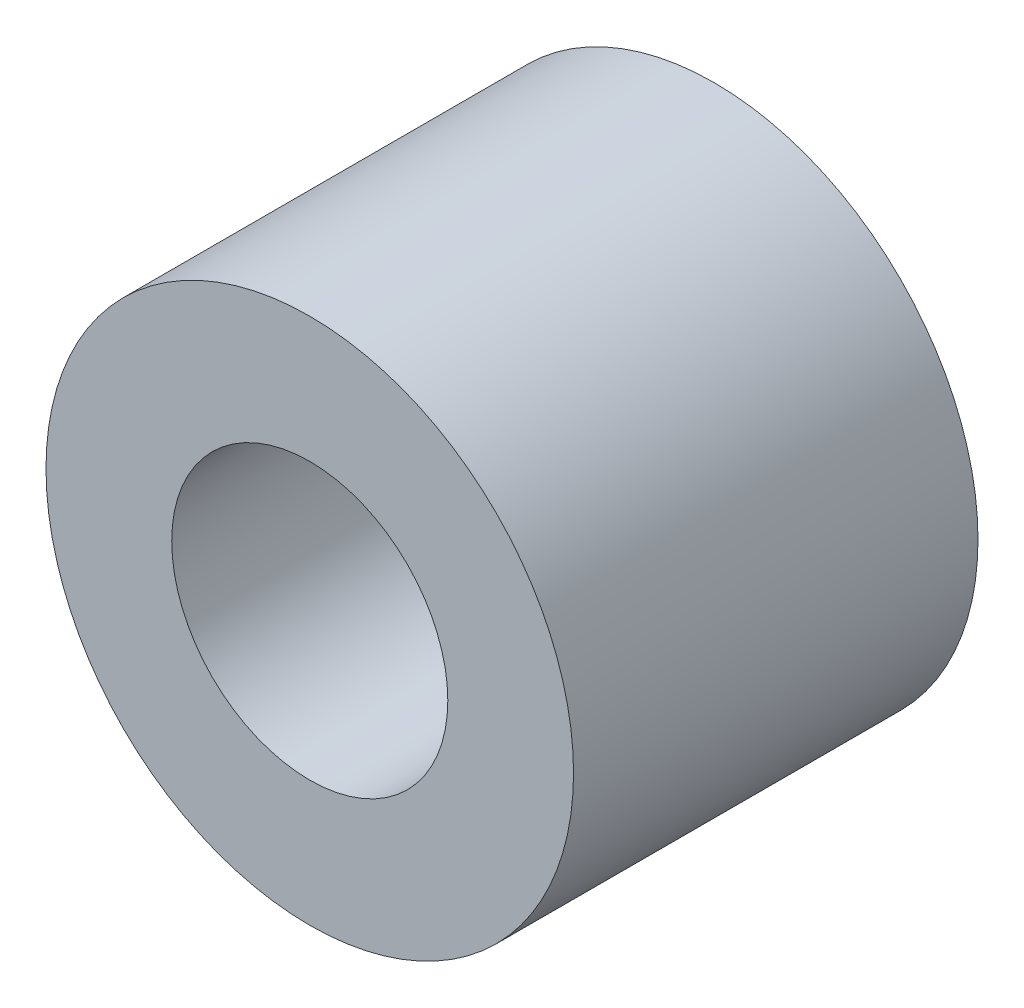
ISO-10303-21;
HEADER;
FILE_DESCRIPTION(('STEP AP214'),'2;1');
FILE_NAME('part.step','',(''),(''),'','','');
FILE_SCHEMA(('AUTOMOTIVE_DESIGN { 1 0 10303 214 1 1 1 1 }'));
ENDSEC;
DATA;
#1=APPLICATION_CONTEXT('core data for automotive mechanical design processes');
#2=APPLICATION_PROTOCOL_DEFINITION('international standard','automotive_design',2000,#1);
#3=PRODUCT_CONTEXT('',#1,'mechanical');
#4=PRODUCT('Part','Part','',(#3));
#5=PRODUCT_RELATED_PRODUCT_CATEGORY('part','',(#4));
#6=PRODUCT_DEFINITION_FORMATION('','',#4);
#7=PRODUCT_DEFINITION_CONTEXT('part definition',#1,'design');
#8=PRODUCT_DEFINITION('design','',#6,#7);
#9=PRODUCT_DEFINITION_SHAPE('','',#8);
#10=(LENGTH_UNIT() NAMED_UNIT(*) SI_UNIT(.MILLI.,.METRE.));
#11=(NAMED_UNIT(*) PLANE_ANGLE_UNIT() SI_UNIT($,.RADIAN.));
#12=(NAMED_UNIT(*) SI_UNIT($,.STERADIAN.) SOLID_ANGLE_UNIT());
#13=UNCERTAINTY_MEASURE_WITH_UNIT(LENGTH_MEASURE(1.E-05),#10,'distance_accuracy_value','');
#14=(GEOMETRIC_REPRESENTATION_CONTEXT(3) GLOBAL_UNCERTAINTY_ASSIGNED_CONTEXT((#13)) GLOBAL_UNIT_ASSIGNED_CONTEXT((#10,
#11,#12)) REPRESENTATION_CONTEXT('',''));
#15=CARTESIAN_POINT('',(0.,0.,0.));
#16=DIRECTION('',(0.,0.,1.));
#17=DIRECTION('',(1.,0.,0.));
#18=AXIS2_PLACEMENT_3D('',#15,#16,#17);
#19=CARTESIAN_POINT('',(0.,0.,-23.));
#20=DIRECTION('',(0.,0.,1.));
#21=DIRECTION('',(1.,0.,0.));
#22=AXIS2_PLACEMENT_3D('',#19,#20,#21);
#23=CYLINDRICAL_SURFACE('',#22,15.);
#24=CARTESIAN_POINT('',(0.,0.,-23.));
#25=DIRECTION('',(0.,0.,1.));
#26=DIRECTION('',(1.,0.,0.));
#27=AXIS2_PLACEMENT_3D('',#24,#25,#26);
#28=CIRCLE('',#27,15.);
#29=CARTESIAN_POINT('',(15.,0.,-23.));
#30=VERTEX_POINT('',#29);
#31=EDGE_CURVE('E10',#30,#30,#28,.T.);
#32=ORIENTED_EDGE('',*,*,#31,.T.);
#33=EDGE_LOOP('',(#32));
#34=FACE_BOUND('',#33,.T.);
#35=CARTESIAN_POINT('',(0.,0.,0.));
#36=DIRECTION('',(0.,0.,1.));
#37=DIRECTION('',(1.,0.,0.));
#38=AXIS2_PLACEMENT_3D('',#35,#36,#37);
#39=CIRCLE('',#38,15.);
#40=CARTESIAN_POINT('',(15.,0.,0.));
#41=VERTEX_POINT('',#40);
#42=EDGE_CURVE('E40',#41,#41,#39,.T.);
#43=ORIENTED_EDGE('',*,*,#42,.F.);
#44=EDGE_LOOP('',(#43));
#45=FACE_BOUND('',#44,.T.);
#46=ADVANCED_FACE('F33',(#34,#45),#23,.T.);
#47=CARTESIAN_POINT('',(0.,0.,-23.));
#48=DIRECTION('',(0.,0.,1.));
#49=DIRECTION('',(1.,0.,0.));
#50=AXIS2_PLACEMENT_3D('',#47,#48,#49);
#51=PLANE('',#50);
#52=CARTESIAN_POINT('',(0.,0.,-23.));
#53=DIRECTION('',(0.,0.,-1.));
#54=DIRECTION('',(-1.,0.,0.));
#55=AXIS2_PLACEMENT_3D('',#52,#53,#54);
#56=CIRCLE('',#55,1.5);
#57=CARTESIAN_POINT('',(-1.5,0.,-23.));
#58=VERTEX_POINT('',#57);
#59=EDGE_CURVE('E52',#58,#58,#56,.T.);
#60=ORIENTED_EDGE('',*,*,#59,.F.);
#61=EDGE_LOOP('',(#60));
#62=FACE_BOUND('',#61,.T.);
#63=ORIENTED_EDGE('',*,*,#31,.F.);
#64=EDGE_LOOP('',(#63));
#65=FACE_BOUND('',#64,.T.);
#66=ADVANCED_FACE('F76',(#62,#65),#51,.F.);
#67=CARTESIAN_POINT('',(0.,0.,0.));
#68=DIRECTION('',(0.,0.,1.));
#69=DIRECTION('',(1.,0.,0.));
#70=AXIS2_PLACEMENT_3D('',#67,#68,#69);
#71=PLANE('',#70);
#72=CARTESIAN_POINT('',(0.,0.,0.));
#73=DIRECTION('',(0.,0.,1.));
#74=DIRECTION('',(1.,0.,0.));
#75=AXIS2_PLACEMENT_3D('',#72,#73,#74);
#76=CIRCLE('',#75,7.85);
#77=CARTESIAN_POINT('',(7.85,0.,0.));
#78=VERTEX_POINT('',#77);
#79=EDGE_CURVE('E47',#78,#78,#76,.T.);
#80=ORIENTED_EDGE('',*,*,#79,.F.);
#81=EDGE_LOOP('',(#80));
#82=FACE_BOUND('',#81,.T.);
#83=ORIENTED_EDGE('',*,*,#42,.T.);
#84=EDGE_LOOP('',(#83));
#85=FACE_BOUND('',#84,.T.);
#86=ADVANCED_FACE('F70',(#82,#85),#71,.T.);
#87=CARTESIAN_POINT('',(0.,0.,-16.));
#88=DIRECTION('',(0.,0.,1.));
#89=DIRECTION('',(1.,0.,0.));
#90=AXIS2_PLACEMENT_3D('',#87,#88,#89);
#91=CYLINDRICAL_SURFACE('',#90,7.85);
#92=CARTESIAN_POINT('',(0.,0.,-16.));
#93=DIRECTION('',(0.,0.,1.));
#94=DIRECTION('',(1.,0.,0.));
#95=AXIS2_PLACEMENT_3D('',#92,#93,#94);
#96=CIRCLE('',#95,7.85);
#97=CARTESIAN_POINT('',(7.85,0.,-16.));
#98=VERTEX_POINT('',#97);
#99=EDGE_CURVE('E45',#98,#98,#96,.T.);
#100=ORIENTED_EDGE('',*,*,#99,.F.);
#101=EDGE_LOOP('',(#100));
#102=FACE_BOUND('',#101,.T.);
#103=ORIENTED_EDGE('',*,*,#79,.T.);
#104=EDGE_LOOP('',(#103));
#105=FACE_BOUND('',#104,.T.);
#106=ADVANCED_FACE('F64',(#102,#105),#91,.F.);
#107=CARTESIAN_POINT('',(0.,0.,-16.));
#108=DIRECTION('',(0.,0.,1.));
#109=DIRECTION('',(1.,0.,0.));
#110=AXIS2_PLACEMENT_3D('',#107,#108,#109);
#111=PLANE('',#110);
#112=CARTESIAN_POINT('',(0.,0.,-16.));
#113=DIRECTION('',(0.,0.,1.));
#114=DIRECTION('',(1.,0.,0.));
#115=AXIS2_PLACEMENT_3D('',#112,#113,#114);
#116=CIRCLE('',#115,1.5);
#117=CARTESIAN_POINT('',(1.5,0.,-16.));
#118=VERTEX_POINT('',#117);
#119=EDGE_CURVE('E36',#118,#118,#116,.T.);
#120=ORIENTED_EDGE('',*,*,#119,.F.);
#121=EDGE_LOOP('',(#120));
#122=FACE_BOUND('',#121,.T.);
#123=ORIENTED_EDGE('',*,*,#99,.T.);
#124=EDGE_LOOP('',(#123));
#125=FACE_BOUND('',#124,.T.);
#126=ADVANCED_FACE('F61',(#122,#125),#111,.T.);
#127=CARTESIAN_POINT('',(0.,0.,-7.));
#128=DIRECTION('',(0.,0.,-1.));
#129=DIRECTION('',(-1.,0.,0.));
#130=AXIS2_PLACEMENT_3D('',#127,#128,#129);
#131=CYLINDRICAL_SURFACE('',#130,1.5);
#132=ORIENTED_EDGE('',*,*,#119,.T.);
#133=EDGE_LOOP('',(#132));
#134=FACE_BOUND('',#133,.T.);
#135=ORIENTED_EDGE('',*,*,#59,.T.);
#136=EDGE_LOOP('',(#135));
#137=FACE_BOUND('',#136,.T.);
#138=ADVANCED_FACE('F59',(#134,#137),#131,.F.);
#139=CLOSED_SHELL('',(#46,#66,#86,#106,#126,#138));
#140=MANIFOLD_SOLID_BREP('B2',#139);
#141=ADVANCED_BREP_SHAPE_REPRESENTATION('',(#18,#140),#14);
#142=SHAPE_DEFINITION_REPRESENTATION(#9,#141);
ENDSEC;
END-ISO-10303-21;
